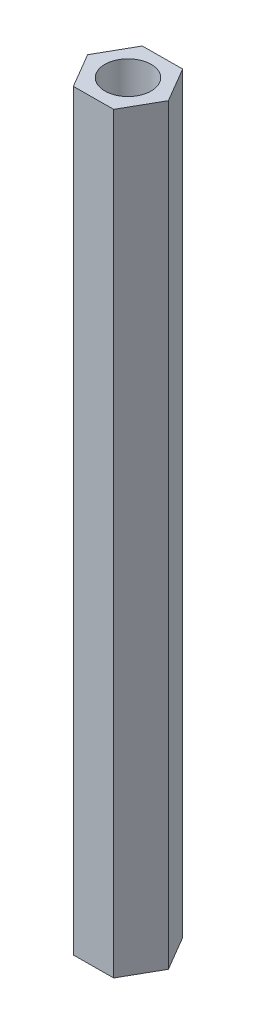
ISO-10303-21;
HEADER;
FILE_DESCRIPTION(('STEP AP214'),'2;1');
FILE_NAME('part.step','',(''),(''),'','','');
FILE_SCHEMA(('AUTOMOTIVE_DESIGN { 1 0 10303 214 1 1 1 1 }'));
ENDSEC;
DATA;
#1=APPLICATION_CONTEXT('core data for automotive mechanical design processes');
#2=APPLICATION_PROTOCOL_DEFINITION('international standard','automotive_design',2000,#1);
#3=PRODUCT_CONTEXT('',#1,'mechanical');
#4=PRODUCT('Part','Part','',(#3));
#5=PRODUCT_RELATED_PRODUCT_CATEGORY('part','',(#4));
#6=PRODUCT_DEFINITION_FORMATION('','',#4);
#7=PRODUCT_DEFINITION_CONTEXT('part definition',#1,'design');
#8=PRODUCT_DEFINITION('design','',#6,#7);
#9=PRODUCT_DEFINITION_SHAPE('','',#8);
#10=(LENGTH_UNIT() NAMED_UNIT(*) SI_UNIT(.MILLI.,.METRE.));
#11=(NAMED_UNIT(*) PLANE_ANGLE_UNIT() SI_UNIT($,.RADIAN.));
#12=(NAMED_UNIT(*) SI_UNIT($,.STERADIAN.) SOLID_ANGLE_UNIT());
#13=UNCERTAINTY_MEASURE_WITH_UNIT(LENGTH_MEASURE(1.E-05),#10,'distance_accuracy_value','');
#14=(GEOMETRIC_REPRESENTATION_CONTEXT(3) GLOBAL_UNCERTAINTY_ASSIGNED_CONTEXT((#13)) GLOBAL_UNIT_ASSIGNED_CONTEXT((#10,
#11,#12)) REPRESENTATION_CONTEXT('',''));
#15=CARTESIAN_POINT('',(0.,0.,0.));
#16=DIRECTION('',(0.,0.,1.));
#17=DIRECTION('',(1.,0.,0.));
#18=AXIS2_PLACEMENT_3D('',#15,#16,#17);
#19=CARTESIAN_POINT('',(2.60863581489932,65.,1.48155971368843));
#20=DIRECTION('',(-0.869545271633108,0.,-0.493853237896143));
#21=DIRECTION('',(-0.493853237896143,0.,0.869545271633108));
#22=AXIS2_PLACEMENT_3D('',#19,#20,#21);
#23=PLANE('',#22);
#24=DIRECTION('',(0.493853237896143,0.,-0.869545271633108));
#25=VECTOR('',#24,1.);
#26=CARTESIAN_POINT('',(2.60863581489932,0.,1.48155971368843));
#27=LINE('',#26,#25);
#28=CARTESIAN_POINT('',(1.7532569153808,0.,2.98765630363825));
#29=VERTEX_POINT('',#28);
#30=CARTESIAN_POINT('',(3.46401471441784,0.,-0.0245368762613956));
#31=VERTEX_POINT('',#30);
#32=EDGE_CURVE('E139',#29,#31,#27,.T.);
#33=ORIENTED_EDGE('',*,*,#32,.T.);
#34=DIRECTION('',(0.,-1.,0.));
#35=VECTOR('',#34,1.);
#36=CARTESIAN_POINT('',(3.46401471441784,65.,-0.0245368762613956));
#37=LINE('',#36,#35);
#38=CARTESIAN_POINT('',(3.46401471441784,65.,-0.0245368762613956));
#39=VERTEX_POINT('',#38);
#40=EDGE_CURVE('E11',#39,#31,#37,.T.);
#41=ORIENTED_EDGE('',*,*,#40,.F.);
#42=DIRECTION('',(0.493853237896143,0.,-0.869545271633108));
#43=VECTOR('',#42,1.);
#44=CARTESIAN_POINT('',(2.60863581489932,65.,1.48155971368843));
#45=LINE('',#44,#43);
#46=CARTESIAN_POINT('',(1.7532569153808,65.,2.98765630363825));
#47=VERTEX_POINT('',#46);
#48=EDGE_CURVE('E172',#47,#39,#45,.T.);
#49=ORIENTED_EDGE('',*,*,#48,.F.);
#50=DIRECTION('',(0.,-1.,0.));
#51=VECTOR('',#50,1.);
#52=CARTESIAN_POINT('',(1.7532569153808,65.,2.98765630363825));
#53=LINE('',#52,#51);
#54=EDGE_CURVE('E131',#47,#29,#53,.T.);
#55=ORIENTED_EDGE('',*,*,#54,.T.);
#56=EDGE_LOOP('',(#33,#41,#49,#55));
#57=FACE_BOUND('',#56,.T.);
#58=ADVANCED_FACE('F45',(#57),#23,.F.);
#59=CARTESIAN_POINT('',(2.58738625672744,65.,-1.51836502808052));
#60=DIRECTION('',(-0.862462085575814,0.,0.50612167602684));
#61=DIRECTION('',(0.50612167602684,0.,0.862462085575814));
#62=AXIS2_PLACEMENT_3D('',#59,#60,#61);
#63=PLANE('',#62);
#64=DIRECTION('',(-0.50612167602684,0.,-0.862462085575814));
#65=VECTOR('',#64,1.);
#66=CARTESIAN_POINT('',(2.58738625672744,0.,-1.51836502808052));
#67=LINE('',#66,#65);
#68=CARTESIAN_POINT('',(1.71075779903704,0.,-3.01219317989965));
#69=VERTEX_POINT('',#68);
#70=EDGE_CURVE('E143',#31,#69,#67,.T.);
#71=ORIENTED_EDGE('',*,*,#70,.T.);
#72=DIRECTION('',(0.,-1.,0.));
#73=VECTOR('',#72,1.);
#74=CARTESIAN_POINT('',(1.71075779903704,65.,-3.01219317989965));
#75=LINE('',#74,#73);
#76=CARTESIAN_POINT('',(1.71075779903704,65.,-3.01219317989965));
#77=VERTEX_POINT('',#76);
#78=EDGE_CURVE('E55',#77,#69,#75,.T.);
#79=ORIENTED_EDGE('',*,*,#78,.F.);
#80=DIRECTION('',(-0.50612167602684,0.,-0.862462085575814));
#81=VECTOR('',#80,1.);
#82=CARTESIAN_POINT('',(2.58738625672744,65.,-1.51836502808052));
#83=LINE('',#82,#81);
#84=EDGE_CURVE('E100',#39,#77,#83,.T.);
#85=ORIENTED_EDGE('',*,*,#84,.F.);
#86=ORIENTED_EDGE('',*,*,#40,.T.);
#87=EDGE_LOOP('',(#71,#79,#85,#86));
#88=FACE_BOUND('',#87,.T.);
#89=ADVANCED_FACE('F186',(#88),#63,.F.);
#90=CARTESIAN_POINT('',(-0.0212495581718826,65.,-2.99992474176895));
#91=DIRECTION('',(0.00708318605729421,0.,0.999974913922983));
#92=DIRECTION('',(0.999974913922983,0.,-0.00708318605729421));
#93=AXIS2_PLACEMENT_3D('',#90,#91,#92);
#94=PLANE('',#93);
#95=DIRECTION('',(-0.999974913922983,0.,0.00708318605729421));
#96=VECTOR('',#95,1.);
#97=CARTESIAN_POINT('',(-0.0212495581718826,0.,-2.99992474176895));
#98=LINE('',#97,#96);
#99=CARTESIAN_POINT('',(-1.7532569153808,0.,-2.98765630363825));
#100=VERTEX_POINT('',#99);
#101=EDGE_CURVE('E146',#69,#100,#98,.T.);
#102=ORIENTED_EDGE('',*,*,#101,.T.);
#103=DIRECTION('',(0.,-1.,0.));
#104=VECTOR('',#103,1.);
#105=CARTESIAN_POINT('',(-1.7532569153808,65.,-2.98765630363825));
#106=LINE('',#105,#104);
#107=CARTESIAN_POINT('',(-1.7532569153808,65.,-2.98765630363825));
#108=VERTEX_POINT('',#107);
#109=EDGE_CURVE('E124',#108,#100,#106,.T.);
#110=ORIENTED_EDGE('',*,*,#109,.F.);
#111=DIRECTION('',(-0.999974913922983,0.,0.00708318605729421));
#112=VECTOR('',#111,1.);
#113=CARTESIAN_POINT('',(-0.0212495581718826,65.,-2.99992474176895));
#114=LINE('',#113,#112);
#115=EDGE_CURVE('E113',#77,#108,#114,.T.);
#116=ORIENTED_EDGE('',*,*,#115,.F.);
#117=ORIENTED_EDGE('',*,*,#78,.T.);
#118=EDGE_LOOP('',(#102,#110,#116,#117));
#119=FACE_BOUND('',#118,.T.);
#120=ADVANCED_FACE('F165',(#119),#94,.F.);
#121=CARTESIAN_POINT('',(-2.60863581489932,65.,-1.48155971368843));
#122=DIRECTION('',(0.869545271633108,0.,0.493853237896143));
#123=DIRECTION('',(0.493853237896143,0.,-0.869545271633108));
#124=AXIS2_PLACEMENT_3D('',#121,#122,#123);
#125=PLANE('',#124);
#126=DIRECTION('',(-0.493853237896143,0.,0.869545271633108));
#127=VECTOR('',#126,1.);
#128=CARTESIAN_POINT('',(-2.60863581489932,0.,-1.48155971368843));
#129=LINE('',#128,#127);
#130=CARTESIAN_POINT('',(-3.46401471441784,0.,0.0245368762613928));
#131=VERTEX_POINT('',#130);
#132=EDGE_CURVE('E122',#100,#131,#129,.T.);
#133=ORIENTED_EDGE('',*,*,#132,.T.);
#134=DIRECTION('',(0.,-1.,0.));
#135=VECTOR('',#134,1.);
#136=CARTESIAN_POINT('',(-3.46401471441784,65.,0.0245368762613928));
#137=LINE('',#136,#135);
#138=CARTESIAN_POINT('',(-3.46401471441784,65.,0.0245368762613928));
#139=VERTEX_POINT('',#138);
#140=EDGE_CURVE('E119',#139,#131,#137,.T.);
#141=ORIENTED_EDGE('',*,*,#140,.F.);
#142=DIRECTION('',(-0.493853237896143,0.,0.869545271633108));
#143=VECTOR('',#142,1.);
#144=CARTESIAN_POINT('',(-2.60863581489932,65.,-1.48155971368843));
#145=LINE('',#144,#143);
#146=EDGE_CURVE('E107',#108,#139,#145,.T.);
#147=ORIENTED_EDGE('',*,*,#146,.F.);
#148=ORIENTED_EDGE('',*,*,#109,.T.);
#149=EDGE_LOOP('',(#133,#141,#147,#148));
#150=FACE_BOUND('',#149,.T.);
#151=ADVANCED_FACE('F120',(#150),#125,.F.);
#152=CARTESIAN_POINT('',(-2.58738625672744,65.,1.51836502808052));
#153=DIRECTION('',(0.862462085575814,0.,-0.50612167602684));
#154=DIRECTION('',(-0.50612167602684,0.,-0.862462085575814));
#155=AXIS2_PLACEMENT_3D('',#152,#153,#154);
#156=PLANE('',#155);
#157=DIRECTION('',(0.50612167602684,0.,0.862462085575814));
#158=VECTOR('',#157,1.);
#159=CARTESIAN_POINT('',(-2.58738625672744,0.,1.51836502808052));
#160=LINE('',#159,#158);
#161=CARTESIAN_POINT('',(-1.71075779903704,0.,3.01219317989965));
#162=VERTEX_POINT('',#161);
#163=EDGE_CURVE('E86',#131,#162,#160,.T.);
#164=ORIENTED_EDGE('',*,*,#163,.T.);
#165=DIRECTION('',(0.,-1.,0.));
#166=VECTOR('',#165,1.);
#167=CARTESIAN_POINT('',(-1.71075779903704,65.,3.01219317989965));
#168=LINE('',#167,#166);
#169=CARTESIAN_POINT('',(-1.71075779903704,65.,3.01219317989965));
#170=VERTEX_POINT('',#169);
#171=EDGE_CURVE('E125',#170,#162,#168,.T.);
#172=ORIENTED_EDGE('',*,*,#171,.F.);
#173=DIRECTION('',(0.50612167602684,0.,0.862462085575814));
#174=VECTOR('',#173,1.);
#175=CARTESIAN_POINT('',(-2.58738625672744,65.,1.51836502808052));
#176=LINE('',#175,#174);
#177=EDGE_CURVE('E111',#139,#170,#176,.T.);
#178=ORIENTED_EDGE('',*,*,#177,.F.);
#179=ORIENTED_EDGE('',*,*,#140,.T.);
#180=EDGE_LOOP('',(#164,#172,#178,#179));
#181=FACE_BOUND('',#180,.T.);
#182=ADVANCED_FACE('F127',(#181),#156,.F.);
#183=CARTESIAN_POINT('',(0.,65.,0.));
#184=DIRECTION('',(0.,-1.,0.));
#185=DIRECTION('',(0.,0.,-1.));
#186=AXIS2_PLACEMENT_3D('',#183,#184,#185);
#187=CYLINDRICAL_SURFACE('',#186,2.);
#188=CARTESIAN_POINT('',(0.,65.,0.));
#189=DIRECTION('',(0.,1.,0.));
#190=DIRECTION('',(0.,0.,1.));
#191=AXIS2_PLACEMENT_3D('',#188,#189,#190);
#192=CIRCLE('',#191,2.);
#193=CARTESIAN_POINT('',(0.,65.,2.));
#194=VERTEX_POINT('',#193);
#195=EDGE_CURVE('E155',#194,#194,#192,.T.);
#196=ORIENTED_EDGE('',*,*,#195,.T.);
#197=EDGE_LOOP('',(#196));
#198=FACE_BOUND('',#197,.T.);
#199=CARTESIAN_POINT('',(0.,0.,0.));
#200=DIRECTION('',(0.,1.,0.));
#201=DIRECTION('',(0.,0.,1.));
#202=AXIS2_PLACEMENT_3D('',#199,#200,#201);
#203=CIRCLE('',#202,2.);
#204=CARTESIAN_POINT('',(0.,0.,2.));
#205=VERTEX_POINT('',#204);
#206=EDGE_CURVE('E135',#205,#205,#203,.T.);
#207=ORIENTED_EDGE('',*,*,#206,.F.);
#208=EDGE_LOOP('',(#207));
#209=FACE_BOUND('',#208,.T.);
#210=ADVANCED_FACE('F47',(#198,#209),#187,.F.);
#211=CARTESIAN_POINT('',(0.0212495581718822,65.,2.99992474176895));
#212=DIRECTION('',(-0.00708318605729408,0.,-0.999974913922983));
#213=DIRECTION('',(-0.999974913922983,0.,0.00708318605729408));
#214=AXIS2_PLACEMENT_3D('',#211,#212,#213);
#215=PLANE('',#214);
#216=DIRECTION('',(0.999974913922983,0.,-0.00708318605729409));
#217=VECTOR('',#216,1.);
#218=CARTESIAN_POINT('',(0.0212495581718822,0.,2.99992474176895));
#219=LINE('',#218,#217);
#220=EDGE_CURVE('E92',#162,#29,#219,.T.);
#221=ORIENTED_EDGE('',*,*,#220,.T.);
#222=ORIENTED_EDGE('',*,*,#54,.F.);
#223=DIRECTION('',(0.999974913922983,0.,-0.00708318605729409));
#224=VECTOR('',#223,1.);
#225=CARTESIAN_POINT('',(0.0212495581718822,65.,2.99992474176895));
#226=LINE('',#225,#224);
#227=EDGE_CURVE('E63',#170,#47,#226,.T.);
#228=ORIENTED_EDGE('',*,*,#227,.F.);
#229=ORIENTED_EDGE('',*,*,#171,.T.);
#230=EDGE_LOOP('',(#221,#222,#228,#229));
#231=FACE_BOUND('',#230,.T.);
#232=ADVANCED_FACE('F173',(#231),#215,.F.);
#233=CARTESIAN_POINT('',(0.,65.,0.));
#234=DIRECTION('',(0.,1.,0.));
#235=DIRECTION('',(0.,0.,1.));
#236=AXIS2_PLACEMENT_3D('',#233,#234,#235);
#237=PLANE('',#236);
#238=ORIENTED_EDGE('',*,*,#195,.F.);
#239=EDGE_LOOP('',(#238));
#240=FACE_BOUND('',#239,.T.);
#241=ORIENTED_EDGE('',*,*,#48,.T.);
#242=ORIENTED_EDGE('',*,*,#84,.T.);
#243=ORIENTED_EDGE('',*,*,#115,.T.);
#244=ORIENTED_EDGE('',*,*,#146,.T.);
#245=ORIENTED_EDGE('',*,*,#177,.T.);
#246=ORIENTED_EDGE('',*,*,#227,.T.);
#247=EDGE_LOOP('',(#241,#242,#243,#244,#245,#246));
#248=FACE_BOUND('',#247,.T.);
#249=ADVANCED_FACE('F109',(#240,#248),#237,.T.);
#250=CARTESIAN_POINT('',(0.,0.,0.));
#251=DIRECTION('',(0.,1.,0.));
#252=DIRECTION('',(0.,0.,1.));
#253=AXIS2_PLACEMENT_3D('',#250,#251,#252);
#254=PLANE('',#253);
#255=ORIENTED_EDGE('',*,*,#206,.T.);
#256=EDGE_LOOP('',(#255));
#257=FACE_BOUND('',#256,.T.);
#258=ORIENTED_EDGE('',*,*,#32,.F.);
#259=ORIENTED_EDGE('',*,*,#220,.F.);
#260=ORIENTED_EDGE('',*,*,#163,.F.);
#261=ORIENTED_EDGE('',*,*,#132,.F.);
#262=ORIENTED_EDGE('',*,*,#101,.F.);
#263=ORIENTED_EDGE('',*,*,#70,.F.);
#264=EDGE_LOOP('',(#258,#259,#260,#261,#262,#263));
#265=FACE_BOUND('',#264,.T.);
#266=ADVANCED_FACE('F168',(#257,#265),#254,.F.);
#267=CLOSED_SHELL('',(#58,#89,#120,#151,#182,#210,#232,#249,#266));
#268=MANIFOLD_SOLID_BREP('B2',#267);
#269=ADVANCED_BREP_SHAPE_REPRESENTATION('',(#18,#268),#14);
#270=SHAPE_DEFINITION_REPRESENTATION(#9,#269);
ENDSEC;
END-ISO-10303-21;
